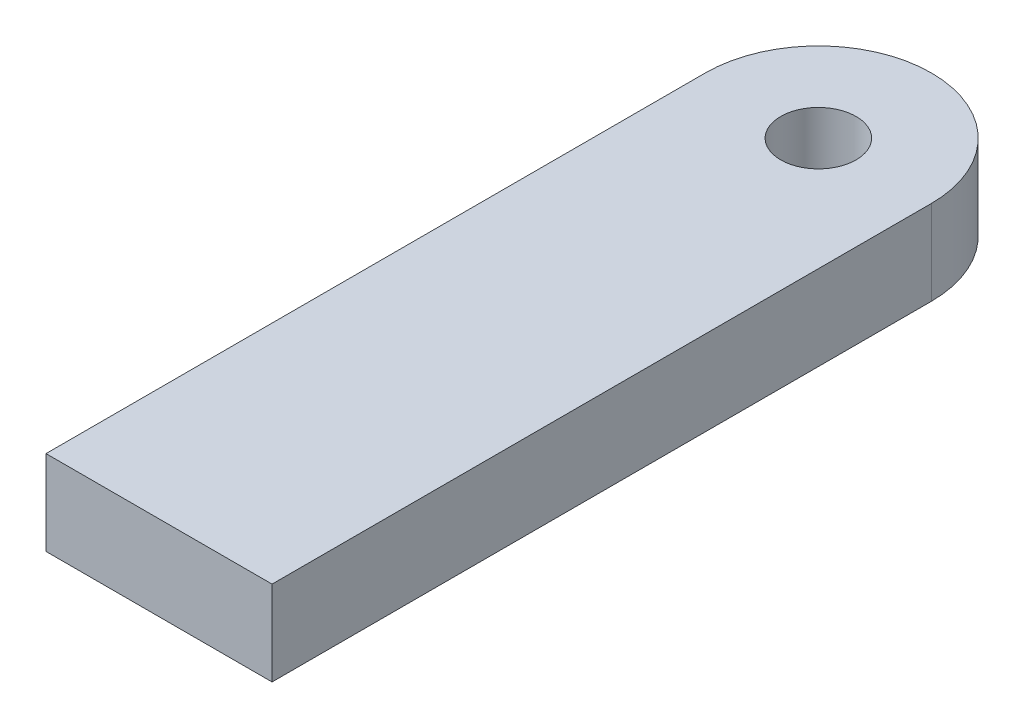
ISO-10303-21;
HEADER;
FILE_DESCRIPTION(('STEP AP214'),'2;1');
FILE_NAME('part.step','',(''),(''),'','','');
FILE_SCHEMA(('AUTOMOTIVE_DESIGN { 1 0 10303 214 1 1 1 1 }'));
ENDSEC;
DATA;
#1=APPLICATION_CONTEXT('core data for automotive mechanical design processes');
#2=APPLICATION_PROTOCOL_DEFINITION('international standard','automotive_design',2000,#1);
#3=PRODUCT_CONTEXT('',#1,'mechanical');
#4=PRODUCT('Part','Part','',(#3));
#5=PRODUCT_RELATED_PRODUCT_CATEGORY('part','',(#4));
#6=PRODUCT_DEFINITION_FORMATION('','',#4);
#7=PRODUCT_DEFINITION_CONTEXT('part definition',#1,'design');
#8=PRODUCT_DEFINITION('design','',#6,#7);
#9=PRODUCT_DEFINITION_SHAPE('','',#8);
#10=(LENGTH_UNIT() NAMED_UNIT(*) SI_UNIT(.MILLI.,.METRE.));
#11=(NAMED_UNIT(*) PLANE_ANGLE_UNIT() SI_UNIT($,.RADIAN.));
#12=(NAMED_UNIT(*) SI_UNIT($,.STERADIAN.) SOLID_ANGLE_UNIT());
#13=UNCERTAINTY_MEASURE_WITH_UNIT(LENGTH_MEASURE(1.E-05),#10,'distance_accuracy_value','');
#14=(GEOMETRIC_REPRESENTATION_CONTEXT(3) GLOBAL_UNCERTAINTY_ASSIGNED_CONTEXT((#13)) GLOBAL_UNIT_ASSIGNED_CONTEXT((#10,
#11,#12)) REPRESENTATION_CONTEXT('',''));
#15=CARTESIAN_POINT('',(0.,0.,0.));
#16=DIRECTION('',(0.,0.,1.));
#17=DIRECTION('',(1.,0.,0.));
#18=AXIS2_PLACEMENT_3D('',#15,#16,#17);
#19=CARTESIAN_POINT('',(0.,9.,-35.));
#20=DIRECTION('',(0.,1.,0.));
#21=DIRECTION('',(0.,0.,1.));
#22=AXIS2_PLACEMENT_3D('',#19,#20,#21);
#23=PLANE('',#22);
#24=CARTESIAN_POINT('',(0.,9.,-35.));
#25=DIRECTION('',(0.,1.,0.));
#26=DIRECTION('',(0.,0.,1.));
#27=AXIS2_PLACEMENT_3D('',#24,#25,#26);
#28=CIRCLE('',#27,12.);
#29=CARTESIAN_POINT('',(12.,9.,-35.));
#30=VERTEX_POINT('',#29);
#31=CARTESIAN_POINT('',(-12.,9.,-35.));
#32=VERTEX_POINT('',#31);
#33=EDGE_CURVE('E85',#30,#32,#28,.T.);
#34=ORIENTED_EDGE('',*,*,#33,.T.);
#35=DIRECTION('',(0.,0.,1.));
#36=VECTOR('',#35,1.);
#37=CARTESIAN_POINT('',(-12.,9.,35.));
#38=LINE('',#37,#36);
#39=CARTESIAN_POINT('',(-12.,9.,35.));
#40=VERTEX_POINT('',#39);
#41=EDGE_CURVE('E80',#32,#40,#38,.T.);
#42=ORIENTED_EDGE('',*,*,#41,.T.);
#43=DIRECTION('',(1.,0.,0.));
#44=VECTOR('',#43,1.);
#45=CARTESIAN_POINT('',(-12.,9.,35.));
#46=LINE('',#45,#44);
#47=CARTESIAN_POINT('',(12.,9.,35.));
#48=VERTEX_POINT('',#47);
#49=EDGE_CURVE('E83',#40,#48,#46,.T.);
#50=ORIENTED_EDGE('',*,*,#49,.T.);
#51=DIRECTION('',(0.,0.,-1.));
#52=VECTOR('',#51,1.);
#53=CARTESIAN_POINT('',(12.,9.,35.));
#54=LINE('',#53,#52);
#55=EDGE_CURVE('E50',#48,#30,#54,.T.);
#56=ORIENTED_EDGE('',*,*,#55,.T.);
#57=EDGE_LOOP('',(#34,#42,#50,#56));
#58=FACE_BOUND('',#57,.T.);
#59=CARTESIAN_POINT('',(0.,9.,-35.));
#60=DIRECTION('',(0.,1.,0.));
#61=DIRECTION('',(0.,0.,1.));
#62=AXIS2_PLACEMENT_3D('',#59,#60,#61);
#63=CIRCLE('',#62,4.);
#64=CARTESIAN_POINT('',(0.,9.,-31.));
#65=VERTEX_POINT('',#64);
#66=EDGE_CURVE('E100',#65,#65,#63,.T.);
#67=ORIENTED_EDGE('',*,*,#66,.F.);
#68=EDGE_LOOP('',(#67));
#69=FACE_BOUND('',#68,.T.);
#70=ADVANCED_FACE('F33',(#58,#69),#23,.T.);
#71=CARTESIAN_POINT('',(0.,0.,-35.));
#72=DIRECTION('',(0.,1.,0.));
#73=DIRECTION('',(0.,0.,1.));
#74=AXIS2_PLACEMENT_3D('',#71,#72,#73);
#75=PLANE('',#74);
#76=CARTESIAN_POINT('',(0.,0.,-35.));
#77=DIRECTION('',(0.,1.,0.));
#78=DIRECTION('',(0.,0.,1.));
#79=AXIS2_PLACEMENT_3D('',#76,#77,#78);
#80=CIRCLE('',#79,12.);
#81=CARTESIAN_POINT('',(12.,0.,-35.));
#82=VERTEX_POINT('',#81);
#83=CARTESIAN_POINT('',(-12.,0.,-35.));
#84=VERTEX_POINT('',#83);
#85=EDGE_CURVE('E97',#82,#84,#80,.T.);
#86=ORIENTED_EDGE('',*,*,#85,.F.);
#87=DIRECTION('',(0.,0.,-1.));
#88=VECTOR('',#87,1.);
#89=CARTESIAN_POINT('',(12.,0.,35.));
#90=LINE('',#89,#88);
#91=CARTESIAN_POINT('',(12.,0.,35.));
#92=VERTEX_POINT('',#91);
#93=EDGE_CURVE('E73',#92,#82,#90,.T.);
#94=ORIENTED_EDGE('',*,*,#93,.F.);
#95=DIRECTION('',(1.,0.,0.));
#96=VECTOR('',#95,1.);
#97=CARTESIAN_POINT('',(-12.,0.,35.));
#98=LINE('',#97,#96);
#99=CARTESIAN_POINT('',(-12.,0.,35.));
#100=VERTEX_POINT('',#99);
#101=EDGE_CURVE('E67',#100,#92,#98,.T.);
#102=ORIENTED_EDGE('',*,*,#101,.F.);
#103=DIRECTION('',(0.,0.,1.));
#104=VECTOR('',#103,1.);
#105=CARTESIAN_POINT('',(-12.,0.,35.));
#106=LINE('',#105,#104);
#107=EDGE_CURVE('E89',#84,#100,#106,.T.);
#108=ORIENTED_EDGE('',*,*,#107,.F.);
#109=EDGE_LOOP('',(#86,#94,#102,#108));
#110=FACE_BOUND('',#109,.T.);
#111=CARTESIAN_POINT('',(0.,0.,-35.));
#112=DIRECTION('',(0.,1.,0.));
#113=DIRECTION('',(0.,0.,1.));
#114=AXIS2_PLACEMENT_3D('',#111,#112,#113);
#115=CIRCLE('',#114,4.);
#116=CARTESIAN_POINT('',(0.,0.,-31.));
#117=VERTEX_POINT('',#116);
#118=EDGE_CURVE('E112',#117,#117,#115,.T.);
#119=ORIENTED_EDGE('',*,*,#118,.T.);
#120=EDGE_LOOP('',(#119));
#121=FACE_BOUND('',#120,.T.);
#122=ADVANCED_FACE('F108',(#110,#121),#75,.F.);
#123=CARTESIAN_POINT('',(0.,9.,-35.));
#124=DIRECTION('',(0.,-1.,0.));
#125=DIRECTION('',(0.,0.,-1.));
#126=AXIS2_PLACEMENT_3D('',#123,#124,#125);
#127=CYLINDRICAL_SURFACE('',#126,12.);
#128=ORIENTED_EDGE('',*,*,#85,.T.);
#129=DIRECTION('',(0.,-1.,0.));
#130=VECTOR('',#129,1.);
#131=CARTESIAN_POINT('',(-12.,9.,-35.));
#132=LINE('',#131,#130);
#133=EDGE_CURVE('E11',#32,#84,#132,.T.);
#134=ORIENTED_EDGE('',*,*,#133,.F.);
#135=ORIENTED_EDGE('',*,*,#33,.F.);
#136=DIRECTION('',(0.,-1.,0.));
#137=VECTOR('',#136,1.);
#138=CARTESIAN_POINT('',(12.,9.,-35.));
#139=LINE('',#138,#137);
#140=EDGE_CURVE('E93',#30,#82,#139,.T.);
#141=ORIENTED_EDGE('',*,*,#140,.T.);
#142=EDGE_LOOP('',(#128,#134,#135,#141));
#143=FACE_BOUND('',#142,.T.);
#144=ADVANCED_FACE('F35',(#143),#127,.T.);
#145=CARTESIAN_POINT('',(-12.,9.,35.));
#146=DIRECTION('',(1.,0.,0.));
#147=DIRECTION('',(0.,0.,-1.));
#148=AXIS2_PLACEMENT_3D('',#145,#146,#147);
#149=PLANE('',#148);
#150=ORIENTED_EDGE('',*,*,#107,.T.);
#151=DIRECTION('',(0.,-1.,0.));
#152=VECTOR('',#151,1.);
#153=CARTESIAN_POINT('',(-12.,9.,35.));
#154=LINE('',#153,#152);
#155=EDGE_CURVE('E42',#40,#100,#154,.T.);
#156=ORIENTED_EDGE('',*,*,#155,.F.);
#157=ORIENTED_EDGE('',*,*,#41,.F.);
#158=ORIENTED_EDGE('',*,*,#133,.T.);
#159=EDGE_LOOP('',(#150,#156,#157,#158));
#160=FACE_BOUND('',#159,.T.);
#161=ADVANCED_FACE('F88',(#160),#149,.F.);
#162=CARTESIAN_POINT('',(-12.,9.,35.));
#163=DIRECTION('',(0.,0.,-1.));
#164=DIRECTION('',(-1.,0.,0.));
#165=AXIS2_PLACEMENT_3D('',#162,#163,#164);
#166=PLANE('',#165);
#167=ORIENTED_EDGE('',*,*,#101,.T.);
#168=DIRECTION('',(0.,-1.,0.));
#169=VECTOR('',#168,1.);
#170=CARTESIAN_POINT('',(12.,9.,35.));
#171=LINE('',#170,#169);
#172=EDGE_CURVE('E90',#48,#92,#171,.T.);
#173=ORIENTED_EDGE('',*,*,#172,.F.);
#174=ORIENTED_EDGE('',*,*,#49,.F.);
#175=ORIENTED_EDGE('',*,*,#155,.T.);
#176=EDGE_LOOP('',(#167,#173,#174,#175));
#177=FACE_BOUND('',#176,.T.);
#178=ADVANCED_FACE('F91',(#177),#166,.F.);
#179=CARTESIAN_POINT('',(12.,9.,35.));
#180=DIRECTION('',(-1.,0.,0.));
#181=DIRECTION('',(0.,0.,1.));
#182=AXIS2_PLACEMENT_3D('',#179,#180,#181);
#183=PLANE('',#182);
#184=ORIENTED_EDGE('',*,*,#93,.T.);
#185=ORIENTED_EDGE('',*,*,#140,.F.);
#186=ORIENTED_EDGE('',*,*,#55,.F.);
#187=ORIENTED_EDGE('',*,*,#172,.T.);
#188=EDGE_LOOP('',(#184,#185,#186,#187));
#189=FACE_BOUND('',#188,.T.);
#190=ADVANCED_FACE('F105',(#189),#183,.F.);
#191=CARTESIAN_POINT('',(0.,9.,-35.));
#192=DIRECTION('',(0.,-1.,0.));
#193=DIRECTION('',(0.,0.,-1.));
#194=AXIS2_PLACEMENT_3D('',#191,#192,#193);
#195=CYLINDRICAL_SURFACE('',#194,4.);
#196=ORIENTED_EDGE('',*,*,#66,.T.);
#197=EDGE_LOOP('',(#196));
#198=FACE_BOUND('',#197,.T.);
#199=ORIENTED_EDGE('',*,*,#118,.F.);
#200=EDGE_LOOP('',(#199));
#201=FACE_BOUND('',#200,.T.);
#202=ADVANCED_FACE('F118',(#198,#201),#195,.F.);
#203=CLOSED_SHELL('',(#70,#122,#144,#161,#178,#190,#202));
#204=MANIFOLD_SOLID_BREP('B2',#203);
#205=ADVANCED_BREP_SHAPE_REPRESENTATION('',(#18,#204),#14);
#206=SHAPE_DEFINITION_REPRESENTATION(#9,#205);
ENDSEC;
END-ISO-10303-21;
